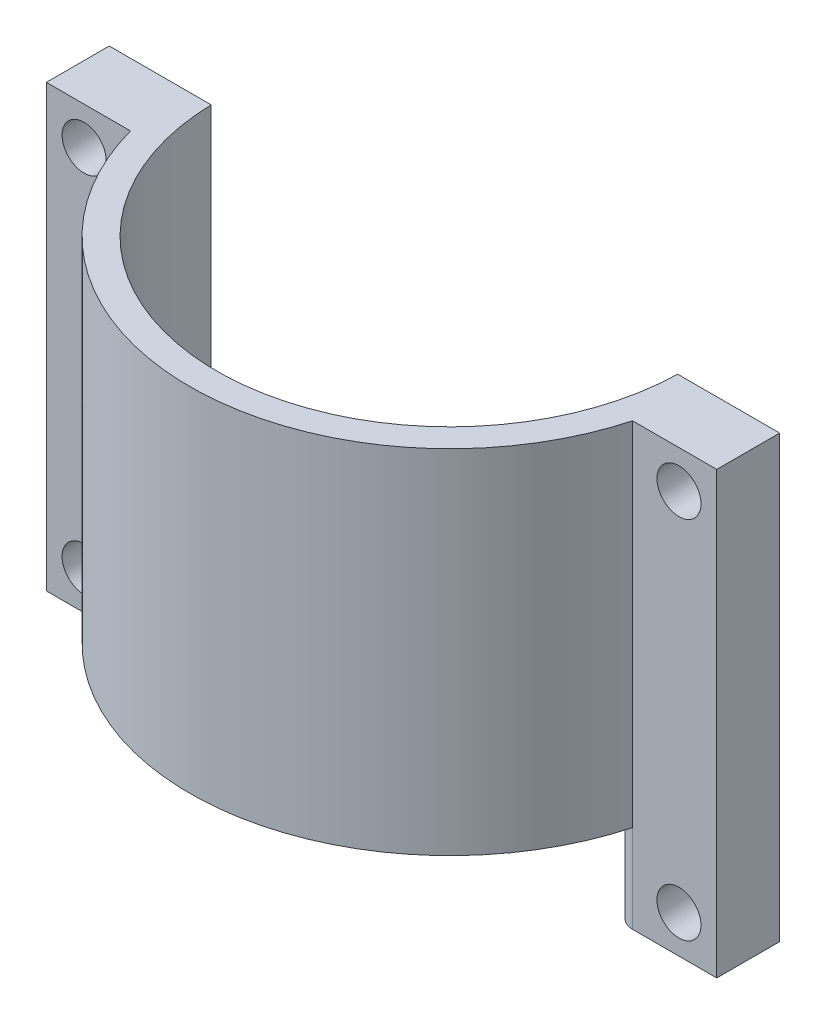
ISO-10303-21;
HEADER;
FILE_DESCRIPTION(('STEP AP214'),'2;1');
FILE_NAME('part.step','',(''),(''),'','','');
FILE_SCHEMA(('AUTOMOTIVE_DESIGN { 1 0 10303 214 1 1 1 1 }'));
ENDSEC;
DATA;
#1=APPLICATION_CONTEXT('core data for automotive mechanical design processes');
#2=APPLICATION_PROTOCOL_DEFINITION('international standard','automotive_design',2000,#1);
#3=PRODUCT_CONTEXT('',#1,'mechanical');
#4=PRODUCT('Part','Part','',(#3));
#5=PRODUCT_RELATED_PRODUCT_CATEGORY('part','',(#4));
#6=PRODUCT_DEFINITION_FORMATION('','',#4);
#7=PRODUCT_DEFINITION_CONTEXT('part definition',#1,'design');
#8=PRODUCT_DEFINITION('design','',#6,#7);
#9=PRODUCT_DEFINITION_SHAPE('','',#8);
#10=(LENGTH_UNIT() NAMED_UNIT(*) SI_UNIT(.MILLI.,.METRE.));
#11=(NAMED_UNIT(*) PLANE_ANGLE_UNIT() SI_UNIT($,.RADIAN.));
#12=(NAMED_UNIT(*) SI_UNIT($,.STERADIAN.) SOLID_ANGLE_UNIT());
#13=UNCERTAINTY_MEASURE_WITH_UNIT(LENGTH_MEASURE(1.E-05),#10,'distance_accuracy_value','');
#14=(GEOMETRIC_REPRESENTATION_CONTEXT(3) GLOBAL_UNCERTAINTY_ASSIGNED_CONTEXT((#13)) GLOBAL_UNIT_ASSIGNED_CONTEXT((#10,
#11,#12)) REPRESENTATION_CONTEXT('',''));
#15=CARTESIAN_POINT('',(0.,0.,0.));
#16=DIRECTION('',(0.,0.,1.));
#17=DIRECTION('',(1.,0.,0.));
#18=AXIS2_PLACEMENT_3D('',#15,#16,#17);
#19=CARTESIAN_POINT('',(23.635,-25.,-0.439203100190171));
#20=DIRECTION('',(0.,1.,0.));
#21=DIRECTION('',(0.,0.,1.));
#22=AXIS2_PLACEMENT_3D('',#19,#20,#21);
#23=CYLINDRICAL_SURFACE('',#22,20.674665640905);
#24=CARTESIAN_POINT('',(23.635,-25.,-0.439203100190171));
#25=DIRECTION('',(0.,1.,0.));
#26=DIRECTION('',(0.,0.,1.));
#27=AXIS2_PLACEMENT_3D('',#24,#25,#26);
#28=CIRCLE('',#27,20.674665640905);
#29=CARTESIAN_POINT('',(3.68865023373705,-25.,5.));
#30=VERTEX_POINT('',#29);
#31=CARTESIAN_POINT('',(43.581349766263,-25.,5.));
#32=VERTEX_POINT('',#31);
#33=EDGE_CURVE('E184',#30,#32,#28,.T.);
#34=ORIENTED_EDGE('',*,*,#33,.T.);
#35=DIRECTION('',(0.,1.,0.));
#36=VECTOR('',#35,1.);
#37=CARTESIAN_POINT('',(43.581349766263,-25.,5.));
#38=LINE('',#37,#36);
#39=CARTESIAN_POINT('',(43.581349766263,3.00000000000002,5.));
#40=VERTEX_POINT('',#39);
#41=EDGE_CURVE('E179',#32,#40,#38,.T.);
#42=ORIENTED_EDGE('',*,*,#41,.T.);
#43=CARTESIAN_POINT('',(23.635,3.00000000000002,-0.439203100190171));
#44=DIRECTION('',(0.,1.,0.));
#45=DIRECTION('',(0.,0.,1.));
#46=AXIS2_PLACEMENT_3D('',#43,#44,#45);
#47=CIRCLE('',#46,20.674665640905);
#48=CARTESIAN_POINT('',(3.68865023373705,3.00000000000002,5.));
#49=VERTEX_POINT('',#48);
#50=EDGE_CURVE('E183',#49,#40,#47,.T.);
#51=ORIENTED_EDGE('',*,*,#50,.F.);
#52=DIRECTION('',(0.,1.,0.));
#53=VECTOR('',#52,1.);
#54=CARTESIAN_POINT('',(3.68865023373705,-25.,5.));
#55=LINE('',#54,#53);
#56=EDGE_CURVE('E199',#49,#30,#55,.F.);
#57=ORIENTED_EDGE('',*,*,#56,.T.);
#58=EDGE_LOOP('',(#34,#42,#51,#57));
#59=FACE_BOUND('',#58,.T.);
#60=ADVANCED_FACE('F39',(#59),#23,.T.);
#61=CARTESIAN_POINT('',(23.635,-25.,-0.439203100190171));
#62=DIRECTION('',(0.,1.,0.));
#63=DIRECTION('',(0.,0.,1.));
#64=AXIS2_PLACEMENT_3D('',#61,#62,#63);
#65=PLANE('',#64);
#66=DIRECTION('',(-1.,0.,0.));
#67=VECTOR('',#66,1.);
#68=CARTESIAN_POINT('',(23.635,-25.,5.));
#69=LINE('',#68,#67);
#70=CARTESIAN_POINT('',(43.57,-25.,5.));
#71=VERTEX_POINT('',#70);
#72=EDGE_CURVE('E246',#32,#71,#69,.T.);
#73=ORIENTED_EDGE('',*,*,#72,.F.);
#74=ORIENTED_EDGE('',*,*,#33,.F.);
#75=DIRECTION('',(-1.,0.,0.));
#76=VECTOR('',#75,1.);
#77=CARTESIAN_POINT('',(0.,-25.,5.));
#78=LINE('',#77,#76);
#79=CARTESIAN_POINT('',(3.7,-25.,5.));
#80=VERTEX_POINT('',#79);
#81=EDGE_CURVE('E203',#80,#30,#78,.T.);
#82=ORIENTED_EDGE('',*,*,#81,.F.);
#83=CARTESIAN_POINT('',(3.7,-25.,3.6));
#84=DIRECTION('',(0.,1.,0.));
#85=DIRECTION('',(0.,0.,1.));
#86=AXIS2_PLACEMENT_3D('',#83,#84,#85);
#87=CIRCLE('',#86,1.4);
#88=CARTESIAN_POINT('',(5.1,-25.,3.6));
#89=VERTEX_POINT('',#88);
#90=EDGE_CURVE('E11',#80,#89,#87,.T.);
#91=ORIENTED_EDGE('',*,*,#90,.T.);
#92=DIRECTION('',(0.,0.,-1.));
#93=VECTOR('',#92,1.);
#94=CARTESIAN_POINT('',(5.1,-25.,5.));
#95=LINE('',#94,#93);
#96=CARTESIAN_POINT('',(5.10000000000001,-25.,0.));
#97=VERTEX_POINT('',#96);
#98=EDGE_CURVE('E242',#89,#97,#95,.T.);
#99=ORIENTED_EDGE('',*,*,#98,.T.);
#100=CARTESIAN_POINT('',(23.635,-25.,-0.439203100190171));
#101=DIRECTION('',(0.,-1.,0.));
#102=DIRECTION('',(0.,0.,1.));
#103=AXIS2_PLACEMENT_3D('',#100,#101,#102);
#104=CIRCLE('',#103,18.5402029213063);
#105=CARTESIAN_POINT('',(42.17,-25.,0.));
#106=VERTEX_POINT('',#105);
#107=EDGE_CURVE('E187',#106,#97,#104,.T.);
#108=ORIENTED_EDGE('',*,*,#107,.F.);
#109=DIRECTION('',(0.,0.,-1.));
#110=VECTOR('',#109,1.);
#111=CARTESIAN_POINT('',(42.17,-25.,-0.439203100190171));
#112=LINE('',#111,#110);
#113=CARTESIAN_POINT('',(42.17,-25.,3.6));
#114=VERTEX_POINT('',#113);
#115=EDGE_CURVE('E244',#114,#106,#112,.T.);
#116=ORIENTED_EDGE('',*,*,#115,.F.);
#117=CARTESIAN_POINT('',(43.57,-25.,3.6));
#118=DIRECTION('',(0.,1.,0.));
#119=DIRECTION('',(0.,0.,1.));
#120=AXIS2_PLACEMENT_3D('',#117,#118,#119);
#121=CIRCLE('',#120,1.4);
#122=EDGE_CURVE('E47',#114,#71,#121,.T.);
#123=ORIENTED_EDGE('',*,*,#122,.T.);
#124=EDGE_LOOP('',(#73,#74,#82,#91,#99,#108,#116,#123));
#125=FACE_BOUND('',#124,.T.);
#126=ADVANCED_FACE('F263',(#125),#65,.F.);
#127=CARTESIAN_POINT('',(5.1,3.,5.));
#128=DIRECTION('',(-1.,0.,0.));
#129=DIRECTION('',(0.,-1.,0.));
#130=AXIS2_PLACEMENT_3D('',#127,#128,#129);
#131=PLANE('',#130);
#132=ORIENTED_EDGE('',*,*,#98,.F.);
#133=DIRECTION('',(0.,1.,0.));
#134=VECTOR('',#133,1.);
#135=CARTESIAN_POINT('',(5.1,-32.,3.6));
#136=LINE('',#135,#134);
#137=CARTESIAN_POINT('',(5.1,-32.,3.6));
#138=VERTEX_POINT('',#137);
#139=EDGE_CURVE('E54',#89,#138,#136,.F.);
#140=ORIENTED_EDGE('',*,*,#139,.T.);
#141=DIRECTION('',(0.,0.,-1.));
#142=VECTOR('',#141,1.);
#143=CARTESIAN_POINT('',(5.1,-32.,5.));
#144=LINE('',#143,#142);
#145=CARTESIAN_POINT('',(5.1,-32.,0.));
#146=VERTEX_POINT('',#145);
#147=EDGE_CURVE('E237',#138,#146,#144,.T.);
#148=ORIENTED_EDGE('',*,*,#147,.T.);
#149=DIRECTION('',(0.,1.,0.));
#150=VECTOR('',#149,1.);
#151=CARTESIAN_POINT('',(5.1,3.,0.));
#152=LINE('',#151,#150);
#153=EDGE_CURVE('E231',#146,#97,#152,.T.);
#154=ORIENTED_EDGE('',*,*,#153,.T.);
#155=EDGE_LOOP('',(#132,#140,#148,#154));
#156=FACE_BOUND('',#155,.T.);
#157=ADVANCED_FACE('F295',(#156),#131,.F.);
#158=CARTESIAN_POINT('',(0.,0.,5.));
#159=DIRECTION('',(0.,0.,1.));
#160=DIRECTION('',(1.,0.,0.));
#161=AXIS2_PLACEMENT_3D('',#158,#159,#160);
#162=PLANE('',#161);
#163=DIRECTION('',(1.,0.,0.));
#164=VECTOR('',#163,1.);
#165=CARTESIAN_POINT('',(-3.,-32.,5.));
#166=LINE('',#165,#164);
#167=CARTESIAN_POINT('',(-3.,-32.,5.));
#168=VERTEX_POINT('',#167);
#169=CARTESIAN_POINT('',(3.7,-32.,5.));
#170=VERTEX_POINT('',#169);
#171=EDGE_CURVE('E220',#168,#170,#166,.T.);
#172=ORIENTED_EDGE('',*,*,#171,.T.);
#173=DIRECTION('',(0.,1.,0.));
#174=VECTOR('',#173,1.);
#175=CARTESIAN_POINT('',(3.7,-25.,5.));
#176=LINE('',#175,#174);
#177=EDGE_CURVE('E256',#170,#80,#176,.T.);
#178=ORIENTED_EDGE('',*,*,#177,.T.);
#179=ORIENTED_EDGE('',*,*,#81,.T.);
#180=ORIENTED_EDGE('',*,*,#56,.F.);
#181=DIRECTION('',(-1.,0.,0.));
#182=VECTOR('',#181,1.);
#183=CARTESIAN_POINT('',(-3.,3.00000000000008,5.));
#184=LINE('',#183,#182);
#185=CARTESIAN_POINT('',(-3.,3.00000000000008,5.));
#186=VERTEX_POINT('',#185);
#187=EDGE_CURVE('E224',#49,#186,#184,.T.);
#188=ORIENTED_EDGE('',*,*,#187,.T.);
#189=DIRECTION('',(0.,-1.,0.));
#190=VECTOR('',#189,1.);
#191=CARTESIAN_POINT('',(-3.,3.00000000000008,5.));
#192=LINE('',#191,#190);
#193=EDGE_CURVE('E218',#186,#168,#192,.T.);
#194=ORIENTED_EDGE('',*,*,#193,.T.);
#195=EDGE_LOOP('',(#172,#178,#179,#180,#188,#194));
#196=FACE_BOUND('',#195,.T.);
#197=CARTESIAN_POINT('',(0.,0.,5.));
#198=DIRECTION('',(0.,0.,1.));
#199=DIRECTION('',(1.,0.,0.));
#200=AXIS2_PLACEMENT_3D('',#197,#198,#199);
#201=CIRCLE('',#200,1.74999999999997);
#202=CARTESIAN_POINT('',(1.74999999999997,0.,5.));
#203=VERTEX_POINT('',#202);
#204=EDGE_CURVE('E212',#203,#203,#201,.T.);
#205=ORIENTED_EDGE('',*,*,#204,.F.);
#206=EDGE_LOOP('',(#205));
#207=FACE_BOUND('',#206,.T.);
#208=CARTESIAN_POINT('',(0.,-29.,5.));
#209=DIRECTION('',(0.,0.,1.));
#210=DIRECTION('',(-1.,0.,0.));
#211=AXIS2_PLACEMENT_3D('',#208,#209,#210);
#212=CIRCLE('',#211,1.75);
#213=CARTESIAN_POINT('',(-1.74999999999999,-29.,5.));
#214=VERTEX_POINT('',#213);
#215=EDGE_CURVE('E206',#214,#214,#212,.T.);
#216=ORIENTED_EDGE('',*,*,#215,.F.);
#217=EDGE_LOOP('',(#216));
#218=FACE_BOUND('',#217,.T.);
#219=ADVANCED_FACE('F285',(#196,#207,#218),#162,.T.);
#220=CARTESIAN_POINT('',(0.,0.,0.));
#221=DIRECTION('',(0.,0.,1.));
#222=DIRECTION('',(1.,0.,0.));
#223=AXIS2_PLACEMENT_3D('',#220,#221,#222);
#224=PLANE('',#223);
#225=DIRECTION('',(0.,-1.,0.));
#226=VECTOR('',#225,1.);
#227=CARTESIAN_POINT('',(-3.,-32.,0.));
#228=LINE('',#227,#226);
#229=CARTESIAN_POINT('',(-3.,3.00000000000008,0.));
#230=VERTEX_POINT('',#229);
#231=CARTESIAN_POINT('',(-3.,-32.,0.));
#232=VERTEX_POINT('',#231);
#233=EDGE_CURVE('E215',#230,#232,#228,.T.);
#234=ORIENTED_EDGE('',*,*,#233,.F.);
#235=DIRECTION('',(-1.,0.,0.));
#236=VECTOR('',#235,1.);
#237=CARTESIAN_POINT('',(-3.,3.00000000000008,0.));
#238=LINE('',#237,#236);
#239=CARTESIAN_POINT('',(5.1,3.,0.));
#240=VERTEX_POINT('',#239);
#241=EDGE_CURVE('E221',#240,#230,#238,.T.);
#242=ORIENTED_EDGE('',*,*,#241,.F.);
#243=DIRECTION('',(0.,1.,0.));
#244=VECTOR('',#243,1.);
#245=CARTESIAN_POINT('',(5.10000000000001,-25.,0.));
#246=LINE('',#245,#244);
#247=EDGE_CURVE('E196',#97,#240,#246,.T.);
#248=ORIENTED_EDGE('',*,*,#247,.F.);
#249=ORIENTED_EDGE('',*,*,#153,.F.);
#250=DIRECTION('',(1.,0.,0.));
#251=VECTOR('',#250,1.);
#252=CARTESIAN_POINT('',(-3.,-32.,0.));
#253=LINE('',#252,#251);
#254=EDGE_CURVE('E228',#232,#146,#253,.T.);
#255=ORIENTED_EDGE('',*,*,#254,.F.);
#256=EDGE_LOOP('',(#234,#242,#248,#249,#255));
#257=FACE_BOUND('',#256,.T.);
#258=CARTESIAN_POINT('',(0.,0.,0.));
#259=DIRECTION('',(0.,0.,1.));
#260=DIRECTION('',(1.,0.,0.));
#261=AXIS2_PLACEMENT_3D('',#258,#259,#260);
#262=CIRCLE('',#261,1.74999999999997);
#263=CARTESIAN_POINT('',(1.74999999999997,0.,0.));
#264=VERTEX_POINT('',#263);
#265=EDGE_CURVE('E209',#264,#264,#262,.T.);
#266=ORIENTED_EDGE('',*,*,#265,.T.);
#267=EDGE_LOOP('',(#266));
#268=FACE_BOUND('',#267,.T.);
#269=CARTESIAN_POINT('',(0.,-29.,0.));
#270=DIRECTION('',(0.,0.,1.));
#271=DIRECTION('',(-1.,0.,0.));
#272=AXIS2_PLACEMENT_3D('',#269,#270,#271);
#273=CIRCLE('',#272,1.75);
#274=CARTESIAN_POINT('',(-1.74999999999999,-29.,0.));
#275=VERTEX_POINT('',#274);
#276=EDGE_CURVE('E205',#275,#275,#273,.T.);
#277=ORIENTED_EDGE('',*,*,#276,.T.);
#278=EDGE_LOOP('',(#277));
#279=FACE_BOUND('',#278,.T.);
#280=ADVANCED_FACE('F299',(#257,#268,#279),#224,.F.);
#281=CARTESIAN_POINT('',(-3.,-32.,5.));
#282=DIRECTION('',(1.,0.,0.));
#283=DIRECTION('',(0.,0.,-1.));
#284=AXIS2_PLACEMENT_3D('',#281,#282,#283);
#285=PLANE('',#284);
#286=ORIENTED_EDGE('',*,*,#233,.T.);
#287=DIRECTION('',(0.,0.,-1.));
#288=VECTOR('',#287,1.);
#289=CARTESIAN_POINT('',(-3.,-32.,5.));
#290=LINE('',#289,#288);
#291=EDGE_CURVE('E239',#168,#232,#290,.T.);
#292=ORIENTED_EDGE('',*,*,#291,.F.);
#293=ORIENTED_EDGE('',*,*,#193,.F.);
#294=DIRECTION('',(0.,0.,-1.));
#295=VECTOR('',#294,1.);
#296=CARTESIAN_POINT('',(-3.,3.00000000000008,5.));
#297=LINE('',#296,#295);
#298=EDGE_CURVE('E226',#186,#230,#297,.T.);
#299=ORIENTED_EDGE('',*,*,#298,.T.);
#300=EDGE_LOOP('',(#286,#292,#293,#299));
#301=FACE_BOUND('',#300,.T.);
#302=ADVANCED_FACE('F309',(#301),#285,.F.);
#303=CARTESIAN_POINT('',(-3.,-32.,5.));
#304=DIRECTION('',(0.,1.,0.));
#305=DIRECTION('',(0.,0.,1.));
#306=AXIS2_PLACEMENT_3D('',#303,#304,#305);
#307=PLANE('',#306);
#308=ORIENTED_EDGE('',*,*,#147,.F.);
#309=CARTESIAN_POINT('',(3.7,-32.,3.6));
#310=DIRECTION('',(0.,1.,0.));
#311=DIRECTION('',(0.,0.,1.));
#312=AXIS2_PLACEMENT_3D('',#309,#310,#311);
#313=CIRCLE('',#312,1.4);
#314=EDGE_CURVE('E260',#138,#170,#313,.F.);
#315=ORIENTED_EDGE('',*,*,#314,.T.);
#316=ORIENTED_EDGE('',*,*,#171,.F.);
#317=ORIENTED_EDGE('',*,*,#291,.T.);
#318=ORIENTED_EDGE('',*,*,#254,.T.);
#319=EDGE_LOOP('',(#308,#315,#316,#317,#318));
#320=FACE_BOUND('',#319,.T.);
#321=ADVANCED_FACE('F292',(#320),#307,.F.);
#322=CARTESIAN_POINT('',(-3.,3.00000000000008,5.));
#323=DIRECTION('',(0.,-1.,0.));
#324=DIRECTION('',(1.,0.,0.));
#325=AXIS2_PLACEMENT_3D('',#322,#323,#324);
#326=PLANE('',#325);
#327=ORIENTED_EDGE('',*,*,#50,.T.);
#328=DIRECTION('',(-1.,0.,0.));
#329=VECTOR('',#328,1.);
#330=CARTESIAN_POINT('',(50.27,3.00000000000002,5.));
#331=LINE('',#330,#329);
#332=CARTESIAN_POINT('',(50.27,3.00000000000002,5.));
#333=VERTEX_POINT('',#332);
#334=EDGE_CURVE('E161',#333,#40,#331,.T.);
#335=ORIENTED_EDGE('',*,*,#334,.F.);
#336=DIRECTION('',(0.,0.,-1.));
#337=VECTOR('',#336,1.);
#338=CARTESIAN_POINT('',(50.27,3.00000000000002,5.));
#339=LINE('',#338,#337);
#340=CARTESIAN_POINT('',(50.27,3.00000000000002,0.));
#341=VERTEX_POINT('',#340);
#342=EDGE_CURVE('E276',#333,#341,#339,.T.);
#343=ORIENTED_EDGE('',*,*,#342,.T.);
#344=DIRECTION('',(-1.,0.,0.));
#345=VECTOR('',#344,1.);
#346=CARTESIAN_POINT('',(42.17,3.00000000000002,0.));
#347=LINE('',#346,#345);
#348=CARTESIAN_POINT('',(42.17,3.00000000000002,0.));
#349=VERTEX_POINT('',#348);
#350=EDGE_CURVE('E159',#341,#349,#347,.T.);
#351=ORIENTED_EDGE('',*,*,#350,.T.);
#352=CARTESIAN_POINT('',(23.635,3.00000000000002,-0.439203100190171));
#353=DIRECTION('',(0.,-1.,0.));
#354=DIRECTION('',(0.,0.,1.));
#355=AXIS2_PLACEMENT_3D('',#352,#353,#354);
#356=CIRCLE('',#355,18.5402029213063);
#357=EDGE_CURVE('E188',#349,#240,#356,.T.);
#358=ORIENTED_EDGE('',*,*,#357,.T.);
#359=ORIENTED_EDGE('',*,*,#241,.T.);
#360=ORIENTED_EDGE('',*,*,#298,.F.);
#361=ORIENTED_EDGE('',*,*,#187,.F.);
#362=EDGE_LOOP('',(#327,#335,#343,#351,#358,#359,#360,#361));
#363=FACE_BOUND('',#362,.T.);
#364=ADVANCED_FACE('F279',(#363),#326,.F.);
#365=CARTESIAN_POINT('',(0.,0.,5.));
#366=DIRECTION('',(0.,0.,-1.));
#367=DIRECTION('',(-1.,0.,0.));
#368=AXIS2_PLACEMENT_3D('',#365,#366,#367);
#369=CYLINDRICAL_SURFACE('',#368,1.74999999999997);
#370=ORIENTED_EDGE('',*,*,#204,.T.);
#371=EDGE_LOOP('',(#370));
#372=FACE_BOUND('',#371,.T.);
#373=ORIENTED_EDGE('',*,*,#265,.F.);
#374=EDGE_LOOP('',(#373));
#375=FACE_BOUND('',#374,.T.);
#376=ADVANCED_FACE('F331',(#372,#375),#369,.F.);
#377=CARTESIAN_POINT('',(0.,-29.,5.));
#378=DIRECTION('',(0.,0.,-1.));
#379=DIRECTION('',(-1.,0.,0.));
#380=AXIS2_PLACEMENT_3D('',#377,#378,#379);
#381=CYLINDRICAL_SURFACE('',#380,1.75);
#382=ORIENTED_EDGE('',*,*,#215,.T.);
#383=EDGE_LOOP('',(#382));
#384=FACE_BOUND('',#383,.T.);
#385=ORIENTED_EDGE('',*,*,#276,.F.);
#386=EDGE_LOOP('',(#385));
#387=FACE_BOUND('',#386,.T.);
#388=ADVANCED_FACE('F329',(#384,#387),#381,.F.);
#389=CARTESIAN_POINT('',(23.635,-25.,-0.439203100190171));
#390=DIRECTION('',(0.,1.,0.));
#391=DIRECTION('',(0.,0.,1.));
#392=AXIS2_PLACEMENT_3D('',#389,#390,#391);
#393=CYLINDRICAL_SURFACE('',#392,18.5402029213063);
#394=ORIENTED_EDGE('',*,*,#357,.F.);
#395=DIRECTION('',(0.,1.,0.));
#396=VECTOR('',#395,1.);
#397=CARTESIAN_POINT('',(42.17,-25.,0.));
#398=LINE('',#397,#396);
#399=EDGE_CURVE('E191',#106,#349,#398,.T.);
#400=ORIENTED_EDGE('',*,*,#399,.F.);
#401=ORIENTED_EDGE('',*,*,#107,.T.);
#402=ORIENTED_EDGE('',*,*,#247,.T.);
#403=EDGE_LOOP('',(#394,#400,#401,#402));
#404=FACE_BOUND('',#403,.T.);
#405=ADVANCED_FACE('F304',(#404),#393,.F.);
#406=CARTESIAN_POINT('',(42.17,-25.,0.));
#407=DIRECTION('',(0.,0.,-1.));
#408=DIRECTION('',(-1.,0.,0.));
#409=AXIS2_PLACEMENT_3D('',#406,#407,#408);
#410=PLANE('',#409);
#411=ORIENTED_EDGE('',*,*,#350,.F.);
#412=DIRECTION('',(0.,1.,0.));
#413=VECTOR('',#412,1.);
#414=CARTESIAN_POINT('',(50.27,-32.,0.));
#415=LINE('',#414,#413);
#416=CARTESIAN_POINT('',(50.27,-32.,0.));
#417=VERTEX_POINT('',#416);
#418=EDGE_CURVE('E144',#417,#341,#415,.T.);
#419=ORIENTED_EDGE('',*,*,#418,.F.);
#420=DIRECTION('',(1.,0.,0.));
#421=VECTOR('',#420,1.);
#422=CARTESIAN_POINT('',(50.27,-32.,0.));
#423=LINE('',#422,#421);
#424=CARTESIAN_POINT('',(42.17,-32.,0.));
#425=VERTEX_POINT('',#424);
#426=EDGE_CURVE('E132',#425,#417,#423,.T.);
#427=ORIENTED_EDGE('',*,*,#426,.F.);
#428=DIRECTION('',(0.,-1.,0.));
#429=VECTOR('',#428,1.);
#430=CARTESIAN_POINT('',(42.17,3.00000000000002,0.));
#431=LINE('',#430,#429);
#432=EDGE_CURVE('E143',#106,#425,#431,.T.);
#433=ORIENTED_EDGE('',*,*,#432,.F.);
#434=ORIENTED_EDGE('',*,*,#399,.T.);
#435=EDGE_LOOP('',(#411,#419,#427,#433,#434));
#436=FACE_BOUND('',#435,.T.);
#437=CARTESIAN_POINT('',(47.27,0.,0.));
#438=DIRECTION('',(0.,0.,1.));
#439=DIRECTION('',(1.,0.,0.));
#440=AXIS2_PLACEMENT_3D('',#437,#438,#439);
#441=CIRCLE('',#440,1.75);
#442=CARTESIAN_POINT('',(49.02,0.,0.));
#443=VERTEX_POINT('',#442);
#444=EDGE_CURVE('E170',#443,#443,#441,.T.);
#445=ORIENTED_EDGE('',*,*,#444,.T.);
#446=EDGE_LOOP('',(#445));
#447=FACE_BOUND('',#446,.T.);
#448=CARTESIAN_POINT('',(47.27,-29.,0.));
#449=DIRECTION('',(0.,0.,1.));
#450=DIRECTION('',(-1.,0.,0.));
#451=AXIS2_PLACEMENT_3D('',#448,#449,#450);
#452=CIRCLE('',#451,1.75);
#453=CARTESIAN_POINT('',(45.52,-29.,0.));
#454=VERTEX_POINT('',#453);
#455=EDGE_CURVE('E176',#454,#454,#452,.T.);
#456=ORIENTED_EDGE('',*,*,#455,.T.);
#457=EDGE_LOOP('',(#456));
#458=FACE_BOUND('',#457,.T.);
#459=ADVANCED_FACE('F156',(#436,#447,#458),#410,.T.);
#460=CARTESIAN_POINT('',(42.17,3.00000000000002,5.));
#461=DIRECTION('',(1.,0.,0.));
#462=DIRECTION('',(0.,1.,0.));
#463=AXIS2_PLACEMENT_3D('',#460,#461,#462);
#464=PLANE('',#463);
#465=DIRECTION('',(0.,0.,-1.));
#466=VECTOR('',#465,1.);
#467=CARTESIAN_POINT('',(42.17,-32.,5.));
#468=LINE('',#467,#466);
#469=CARTESIAN_POINT('',(42.17,-32.,3.6));
#470=VERTEX_POINT('',#469);
#471=EDGE_CURVE('E138',#470,#425,#468,.T.);
#472=ORIENTED_EDGE('',*,*,#471,.F.);
#473=DIRECTION('',(0.,-1.,0.));
#474=VECTOR('',#473,1.);
#475=CARTESIAN_POINT('',(42.17,3.00000000000002,3.6));
#476=LINE('',#475,#474);
#477=EDGE_CURVE('E254',#470,#114,#476,.F.);
#478=ORIENTED_EDGE('',*,*,#477,.T.);
#479=ORIENTED_EDGE('',*,*,#115,.T.);
#480=ORIENTED_EDGE('',*,*,#432,.T.);
#481=EDGE_LOOP('',(#472,#478,#479,#480));
#482=FACE_BOUND('',#481,.T.);
#483=ADVANCED_FACE('F275',(#482),#464,.F.);
#484=CARTESIAN_POINT('',(0.,0.,5.));
#485=DIRECTION('',(0.,0.,-1.));
#486=DIRECTION('',(-1.,0.,0.));
#487=AXIS2_PLACEMENT_3D('',#484,#485,#486);
#488=PLANE('',#487);
#489=ORIENTED_EDGE('',*,*,#72,.T.);
#490=DIRECTION('',(0.,-1.,0.));
#491=VECTOR('',#490,1.);
#492=CARTESIAN_POINT('',(43.57,0.,5.));
#493=LINE('',#492,#491);
#494=CARTESIAN_POINT('',(43.57,-32.,5.));
#495=VERTEX_POINT('',#494);
#496=EDGE_CURVE('E249',#71,#495,#493,.T.);
#497=ORIENTED_EDGE('',*,*,#496,.T.);
#498=DIRECTION('',(1.,0.,0.));
#499=VECTOR('',#498,1.);
#500=CARTESIAN_POINT('',(50.27,-32.,5.));
#501=LINE('',#500,#499);
#502=CARTESIAN_POINT('',(50.27,-32.,5.));
#503=VERTEX_POINT('',#502);
#504=EDGE_CURVE('E154',#495,#503,#501,.T.);
#505=ORIENTED_EDGE('',*,*,#504,.T.);
#506=DIRECTION('',(0.,1.,0.));
#507=VECTOR('',#506,1.);
#508=CARTESIAN_POINT('',(50.27,3.00000000000002,5.));
#509=LINE('',#508,#507);
#510=EDGE_CURVE('E153',#503,#333,#509,.T.);
#511=ORIENTED_EDGE('',*,*,#510,.T.);
#512=ORIENTED_EDGE('',*,*,#334,.T.);
#513=ORIENTED_EDGE('',*,*,#41,.F.);
#514=EDGE_LOOP('',(#489,#497,#505,#511,#512,#513));
#515=FACE_BOUND('',#514,.T.);
#516=CARTESIAN_POINT('',(47.27,0.,5.));
#517=DIRECTION('',(0.,0.,1.));
#518=DIRECTION('',(1.,0.,0.));
#519=AXIS2_PLACEMENT_3D('',#516,#517,#518);
#520=CIRCLE('',#519,1.75);
#521=CARTESIAN_POINT('',(49.02,0.,5.));
#522=VERTEX_POINT('',#521);
#523=EDGE_CURVE('E166',#522,#522,#520,.T.);
#524=ORIENTED_EDGE('',*,*,#523,.F.);
#525=EDGE_LOOP('',(#524));
#526=FACE_BOUND('',#525,.T.);
#527=CARTESIAN_POINT('',(47.27,-29.,5.));
#528=DIRECTION('',(0.,0.,1.));
#529=DIRECTION('',(-1.,0.,0.));
#530=AXIS2_PLACEMENT_3D('',#527,#528,#529);
#531=CIRCLE('',#530,1.75);
#532=CARTESIAN_POINT('',(45.52,-29.,5.));
#533=VERTEX_POINT('',#532);
#534=EDGE_CURVE('E173',#533,#533,#531,.T.);
#535=ORIENTED_EDGE('',*,*,#534,.F.);
#536=EDGE_LOOP('',(#535));
#537=FACE_BOUND('',#536,.T.);
#538=ADVANCED_FACE('F271',(#515,#526,#537),#488,.F.);
#539=CARTESIAN_POINT('',(50.27,-32.,5.));
#540=DIRECTION('',(0.,1.,0.));
#541=DIRECTION('',(0.,0.,1.));
#542=AXIS2_PLACEMENT_3D('',#539,#540,#541);
#543=PLANE('',#542);
#544=ORIENTED_EDGE('',*,*,#504,.F.);
#545=CARTESIAN_POINT('',(43.57,-32.,3.6));
#546=DIRECTION('',(0.,1.,0.));
#547=DIRECTION('',(0.,0.,1.));
#548=AXIS2_PLACEMENT_3D('',#545,#546,#547);
#549=CIRCLE('',#548,1.4);
#550=EDGE_CURVE('E252',#495,#470,#549,.F.);
#551=ORIENTED_EDGE('',*,*,#550,.T.);
#552=ORIENTED_EDGE('',*,*,#471,.T.);
#553=ORIENTED_EDGE('',*,*,#426,.T.);
#554=DIRECTION('',(0.,0.,-1.));
#555=VECTOR('',#554,1.);
#556=CARTESIAN_POINT('',(50.27,-32.,5.));
#557=LINE('',#556,#555);
#558=EDGE_CURVE('E136',#503,#417,#557,.T.);
#559=ORIENTED_EDGE('',*,*,#558,.F.);
#560=EDGE_LOOP('',(#544,#551,#552,#553,#559));
#561=FACE_BOUND('',#560,.T.);
#562=ADVANCED_FACE('F135',(#561),#543,.F.);
#563=CARTESIAN_POINT('',(50.27,-32.,5.));
#564=DIRECTION('',(-1.,0.,0.));
#565=DIRECTION('',(0.,0.,1.));
#566=AXIS2_PLACEMENT_3D('',#563,#564,#565);
#567=PLANE('',#566);
#568=ORIENTED_EDGE('',*,*,#418,.T.);
#569=ORIENTED_EDGE('',*,*,#342,.F.);
#570=ORIENTED_EDGE('',*,*,#510,.F.);
#571=ORIENTED_EDGE('',*,*,#558,.T.);
#572=EDGE_LOOP('',(#568,#569,#570,#571));
#573=FACE_BOUND('',#572,.T.);
#574=ADVANCED_FACE('F149',(#573),#567,.F.);
#575=CARTESIAN_POINT('',(47.27,0.,5.));
#576=DIRECTION('',(0.,0.,-1.));
#577=DIRECTION('',(-1.,0.,0.));
#578=AXIS2_PLACEMENT_3D('',#575,#576,#577);
#579=CYLINDRICAL_SURFACE('',#578,1.75);
#580=ORIENTED_EDGE('',*,*,#523,.T.);
#581=EDGE_LOOP('',(#580));
#582=FACE_BOUND('',#581,.T.);
#583=ORIENTED_EDGE('',*,*,#444,.F.);
#584=EDGE_LOOP('',(#583));
#585=FACE_BOUND('',#584,.T.);
#586=ADVANCED_FACE('F422',(#582,#585),#579,.F.);
#587=CARTESIAN_POINT('',(47.27,-29.,5.));
#588=DIRECTION('',(0.,0.,-1.));
#589=DIRECTION('',(-1.,0.,0.));
#590=AXIS2_PLACEMENT_3D('',#587,#588,#589);
#591=CYLINDRICAL_SURFACE('',#590,1.75);
#592=ORIENTED_EDGE('',*,*,#534,.T.);
#593=EDGE_LOOP('',(#592));
#594=FACE_BOUND('',#593,.T.);
#595=ORIENTED_EDGE('',*,*,#455,.F.);
#596=EDGE_LOOP('',(#595));
#597=FACE_BOUND('',#596,.T.);
#598=ADVANCED_FACE('F384',(#594,#597),#591,.F.);
#599=CARTESIAN_POINT('',(43.57,0.,3.6));
#600=DIRECTION('',(0.,-1.,0.));
#601=DIRECTION('',(1.,0.,0.));
#602=AXIS2_PLACEMENT_3D('',#599,#600,#601);
#603=CYLINDRICAL_SURFACE('',#602,1.4);
#604=ORIENTED_EDGE('',*,*,#122,.F.);
#605=ORIENTED_EDGE('',*,*,#477,.F.);
#606=ORIENTED_EDGE('',*,*,#550,.F.);
#607=ORIENTED_EDGE('',*,*,#496,.F.);
#608=EDGE_LOOP('',(#604,#605,#606,#607));
#609=FACE_BOUND('',#608,.T.);
#610=ADVANCED_FACE('F273',(#609),#603,.T.);
#611=CARTESIAN_POINT('',(3.7,0.,3.6));
#612=DIRECTION('',(0.,-1.,0.));
#613=DIRECTION('',(1.,0.,0.));
#614=AXIS2_PLACEMENT_3D('',#611,#612,#613);
#615=CYLINDRICAL_SURFACE('',#614,1.4);
#616=ORIENTED_EDGE('',*,*,#314,.F.);
#617=ORIENTED_EDGE('',*,*,#139,.F.);
#618=ORIENTED_EDGE('',*,*,#90,.F.);
#619=ORIENTED_EDGE('',*,*,#177,.F.);
#620=EDGE_LOOP('',(#616,#617,#618,#619));
#621=FACE_BOUND('',#620,.T.);
#622=ADVANCED_FACE('F41',(#621),#615,.T.);
#623=CLOSED_SHELL('',(#60,#126,#157,#219,#280,#302,#321,#364,#376,#388,#405,#459,#483,#538,#562,
#574,#586,#598,#610,#622));
#624=MANIFOLD_SOLID_BREP('B2',#623);
#625=ADVANCED_BREP_SHAPE_REPRESENTATION('',(#18,#624),#14);
#626=SHAPE_DEFINITION_REPRESENTATION(#9,#625);
ENDSEC;
END-ISO-10303-21;
